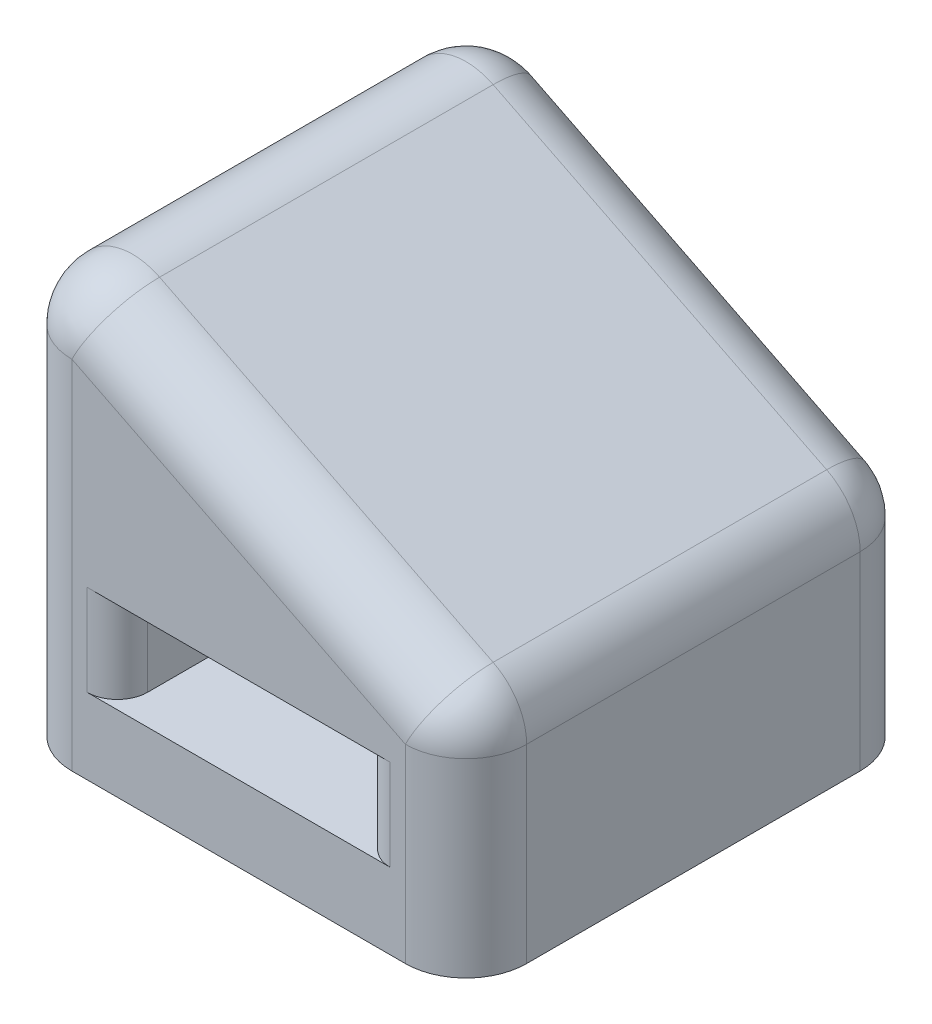
ISO-10303-21;
HEADER;
FILE_DESCRIPTION(('STEP AP214'),'2;1');
FILE_NAME('part.step','',(''),(''),'','','');
FILE_SCHEMA(('AUTOMOTIVE_DESIGN { 1 0 10303 214 1 1 1 1 }'));
ENDSEC;
DATA;
#1=APPLICATION_CONTEXT('core data for automotive mechanical design processes');
#2=APPLICATION_PROTOCOL_DEFINITION('international standard','automotive_design',2000,#1);
#3=PRODUCT_CONTEXT('',#1,'mechanical');
#4=PRODUCT('Part','Part','',(#3));
#5=PRODUCT_RELATED_PRODUCT_CATEGORY('part','',(#4));
#6=PRODUCT_DEFINITION_FORMATION('','',#4);
#7=PRODUCT_DEFINITION_CONTEXT('part definition',#1,'design');
#8=PRODUCT_DEFINITION('design','',#6,#7);
#9=PRODUCT_DEFINITION_SHAPE('','',#8);
#10=(LENGTH_UNIT() NAMED_UNIT(*) SI_UNIT(.MILLI.,.METRE.));
#11=(NAMED_UNIT(*) PLANE_ANGLE_UNIT() SI_UNIT($,.RADIAN.));
#12=(NAMED_UNIT(*) SI_UNIT($,.STERADIAN.) SOLID_ANGLE_UNIT());
#13=UNCERTAINTY_MEASURE_WITH_UNIT(LENGTH_MEASURE(1.E-05),#10,'distance_accuracy_value','');
#14=(GEOMETRIC_REPRESENTATION_CONTEXT(3) GLOBAL_UNCERTAINTY_ASSIGNED_CONTEXT((#13)) GLOBAL_UNIT_ASSIGNED_CONTEXT((#10,
#11,#12)) REPRESENTATION_CONTEXT('',''));
#15=CARTESIAN_POINT('',(0.,0.,0.));
#16=DIRECTION('',(0.,0.,1.));
#17=DIRECTION('',(1.,0.,0.));
#18=AXIS2_PLACEMENT_3D('',#15,#16,#17);
#19=CARTESIAN_POINT('',(5.,2.5,-6.5));
#20=DIRECTION('',(0.,-1.,0.));
#21=DIRECTION('',(1.,0.,0.));
#22=AXIS2_PLACEMENT_3D('',#19,#20,#21);
#23=CYLINDRICAL_SURFACE('',#22,1.);
#24=DIRECTION('',(0.,-1.,0.));
#25=VECTOR('',#24,1.);
#26=CARTESIAN_POINT('',(4.,2.5,-6.5));
#27=LINE('',#26,#25);
#28=CARTESIAN_POINT('',(4.,5.5,-6.5));
#29=VERTEX_POINT('',#28);
#30=CARTESIAN_POINT('',(4.,2.5,-6.5));
#31=VERTEX_POINT('',#30);
#32=EDGE_CURVE('E303',#29,#31,#27,.T.);
#33=ORIENTED_EDGE('',*,*,#32,.F.);
#34=CARTESIAN_POINT('',(5.,5.5,-6.5));
#35=DIRECTION('',(0.,1.,0.));
#36=DIRECTION('',(0.,0.,1.));
#37=AXIS2_PLACEMENT_3D('',#34,#35,#36);
#38=CIRCLE('',#37,1.);
#39=CARTESIAN_POINT('',(5.,5.5,-7.5));
#40=VERTEX_POINT('',#39);
#41=EDGE_CURVE('E40',#29,#40,#38,.F.);
#42=ORIENTED_EDGE('',*,*,#41,.T.);
#43=DIRECTION('',(0.,-1.,0.));
#44=VECTOR('',#43,1.);
#45=CARTESIAN_POINT('',(5.,15.,-7.5));
#46=LINE('',#45,#44);
#47=CARTESIAN_POINT('',(5.,2.5,-7.5));
#48=VERTEX_POINT('',#47);
#49=EDGE_CURVE('E306',#48,#40,#46,.F.);
#50=ORIENTED_EDGE('',*,*,#49,.F.);
#51=CARTESIAN_POINT('',(5.,2.5,-6.5));
#52=DIRECTION('',(0.,-1.,0.));
#53=DIRECTION('',(1.,0.,0.));
#54=AXIS2_PLACEMENT_3D('',#51,#52,#53);
#55=CIRCLE('',#54,1.);
#56=EDGE_CURVE('E11',#48,#31,#55,.F.);
#57=ORIENTED_EDGE('',*,*,#56,.T.);
#58=EDGE_LOOP('',(#33,#42,#50,#57));
#59=FACE_BOUND('',#58,.T.);
#60=ADVANCED_FACE('F33',(#59),#23,.T.);
#61=CARTESIAN_POINT('',(-5.,2.5,-6.5));
#62=DIRECTION('',(0.,1.,0.));
#63=DIRECTION('',(0.,0.,1.));
#64=AXIS2_PLACEMENT_3D('',#61,#62,#63);
#65=CYLINDRICAL_SURFACE('',#64,1.);
#66=DIRECTION('',(0.,1.,0.));
#67=VECTOR('',#66,1.);
#68=CARTESIAN_POINT('',(-4.,2.5,-6.5));
#69=LINE('',#68,#67);
#70=CARTESIAN_POINT('',(-4.,2.5,-6.5));
#71=VERTEX_POINT('',#70);
#72=CARTESIAN_POINT('',(-4.,5.5,-6.5));
#73=VERTEX_POINT('',#72);
#74=EDGE_CURVE('E293',#71,#73,#69,.T.);
#75=ORIENTED_EDGE('',*,*,#74,.F.);
#76=CARTESIAN_POINT('',(-5.,2.5,-6.5));
#77=DIRECTION('',(0.,-1.,0.));
#78=DIRECTION('',(1.,0.,0.));
#79=AXIS2_PLACEMENT_3D('',#76,#77,#78);
#80=CIRCLE('',#79,1.);
#81=CARTESIAN_POINT('',(-5.,2.5,-7.5));
#82=VERTEX_POINT('',#81);
#83=EDGE_CURVE('E298',#71,#82,#80,.F.);
#84=ORIENTED_EDGE('',*,*,#83,.T.);
#85=DIRECTION('',(0.,1.,0.));
#86=VECTOR('',#85,1.);
#87=CARTESIAN_POINT('',(-5.,15.,-7.5));
#88=LINE('',#87,#86);
#89=CARTESIAN_POINT('',(-5.,5.5,-7.5));
#90=VERTEX_POINT('',#89);
#91=EDGE_CURVE('E296',#90,#82,#88,.F.);
#92=ORIENTED_EDGE('',*,*,#91,.F.);
#93=CARTESIAN_POINT('',(-5.,5.5,-6.5));
#94=DIRECTION('',(0.,1.,0.));
#95=DIRECTION('',(0.,0.,1.));
#96=AXIS2_PLACEMENT_3D('',#93,#94,#95);
#97=CIRCLE('',#96,1.);
#98=EDGE_CURVE('E301',#90,#73,#97,.F.);
#99=ORIENTED_EDGE('',*,*,#98,.T.);
#100=EDGE_LOOP('',(#75,#84,#92,#99));
#101=FACE_BOUND('',#100,.T.);
#102=ADVANCED_FACE('F320',(#101),#65,.T.);
#103=CARTESIAN_POINT('',(5.,2.5,6.5));
#104=DIRECTION('',(0.,1.,0.));
#105=DIRECTION('',(-1.,0.,0.));
#106=AXIS2_PLACEMENT_3D('',#103,#104,#105);
#107=CYLINDRICAL_SURFACE('',#106,1.);
#108=DIRECTION('',(0.,1.,0.));
#109=VECTOR('',#108,1.);
#110=CARTESIAN_POINT('',(4.,2.5,6.5));
#111=LINE('',#110,#109);
#112=CARTESIAN_POINT('',(4.,2.5,6.5));
#113=VERTEX_POINT('',#112);
#114=CARTESIAN_POINT('',(4.,5.5,6.5));
#115=VERTEX_POINT('',#114);
#116=EDGE_CURVE('E281',#113,#115,#111,.T.);
#117=ORIENTED_EDGE('',*,*,#116,.F.);
#118=CARTESIAN_POINT('',(5.,2.5,6.5));
#119=DIRECTION('',(0.,-1.,0.));
#120=DIRECTION('',(1.,0.,0.));
#121=AXIS2_PLACEMENT_3D('',#118,#119,#120);
#122=CIRCLE('',#121,1.);
#123=CARTESIAN_POINT('',(5.,2.5,7.5));
#124=VERTEX_POINT('',#123);
#125=EDGE_CURVE('E287',#113,#124,#122,.F.);
#126=ORIENTED_EDGE('',*,*,#125,.T.);
#127=DIRECTION('',(0.,1.,0.));
#128=VECTOR('',#127,1.);
#129=CARTESIAN_POINT('',(5.,15.,7.5));
#130=LINE('',#129,#128);
#131=CARTESIAN_POINT('',(5.,5.5,7.5));
#132=VERTEX_POINT('',#131);
#133=EDGE_CURVE('E284',#132,#124,#130,.F.);
#134=ORIENTED_EDGE('',*,*,#133,.F.);
#135=CARTESIAN_POINT('',(5.,5.5,6.5));
#136=DIRECTION('',(0.,1.,0.));
#137=DIRECTION('',(0.,0.,1.));
#138=AXIS2_PLACEMENT_3D('',#135,#136,#137);
#139=CIRCLE('',#138,1.);
#140=EDGE_CURVE('E290',#132,#115,#139,.F.);
#141=ORIENTED_EDGE('',*,*,#140,.T.);
#142=EDGE_LOOP('',(#117,#126,#134,#141));
#143=FACE_BOUND('',#142,.T.);
#144=ADVANCED_FACE('F343',(#143),#107,.T.);
#145=CARTESIAN_POINT('',(-5.,15.,6.5));
#146=DIRECTION('',(0.,1.,0.));
#147=DIRECTION('',(0.,0.,1.));
#148=AXIS2_PLACEMENT_3D('',#145,#146,#147);
#149=CYLINDRICAL_SURFACE('',#148,1.);
#150=DIRECTION('',(0.,1.,0.));
#151=VECTOR('',#150,1.);
#152=CARTESIAN_POINT('',(-5.,15.,7.5));
#153=LINE('',#152,#151);
#154=CARTESIAN_POINT('',(-5.,2.5,7.5));
#155=VERTEX_POINT('',#154);
#156=CARTESIAN_POINT('',(-5.,5.5,7.5));
#157=VERTEX_POINT('',#156);
#158=EDGE_CURVE('E269',#155,#157,#153,.T.);
#159=ORIENTED_EDGE('',*,*,#158,.F.);
#160=CARTESIAN_POINT('',(-5.,2.5,6.5));
#161=DIRECTION('',(0.,-1.,0.));
#162=DIRECTION('',(1.,0.,0.));
#163=AXIS2_PLACEMENT_3D('',#160,#161,#162);
#164=CIRCLE('',#163,1.);
#165=CARTESIAN_POINT('',(-4.,2.5,6.5));
#166=VERTEX_POINT('',#165);
#167=EDGE_CURVE('E275',#155,#166,#164,.F.);
#168=ORIENTED_EDGE('',*,*,#167,.T.);
#169=DIRECTION('',(0.,1.,0.));
#170=VECTOR('',#169,1.);
#171=CARTESIAN_POINT('',(-4.,2.5,6.5));
#172=LINE('',#171,#170);
#173=CARTESIAN_POINT('',(-4.,5.5,6.5));
#174=VERTEX_POINT('',#173);
#175=EDGE_CURVE('E272',#174,#166,#172,.F.);
#176=ORIENTED_EDGE('',*,*,#175,.F.);
#177=CARTESIAN_POINT('',(-5.,5.5,6.5));
#178=DIRECTION('',(0.,1.,0.));
#179=DIRECTION('',(0.,0.,1.));
#180=AXIS2_PLACEMENT_3D('',#177,#178,#179);
#181=CIRCLE('',#180,1.);
#182=EDGE_CURVE('E278',#174,#157,#181,.F.);
#183=ORIENTED_EDGE('',*,*,#182,.T.);
#184=EDGE_LOOP('',(#159,#168,#176,#183));
#185=FACE_BOUND('',#184,.T.);
#186=ADVANCED_FACE('F337',(#185),#149,.T.);
#187=CARTESIAN_POINT('',(-5.5,11.7639320225002,-7.5));
#188=DIRECTION('',(0.,0.,1.));
#189=DIRECTION('',(1.,0.,0.));
#190=AXIS2_PLACEMENT_3D('',#187,#188,#189);
#191=CYLINDRICAL_SURFACE('',#190,2.);
#192=CARTESIAN_POINT('',(-5.5,11.7639320225002,5.49999999999999));
#193=DIRECTION('',(0.,0.,1.));
#194=DIRECTION('',(1.,0.,0.));
#195=AXIS2_PLACEMENT_3D('',#192,#193,#194);
#196=CIRCLE('',#195,2.);
#197=CARTESIAN_POINT('',(-4.60557280900008,13.5527864045,5.49999999999999));
#198=VERTEX_POINT('',#197);
#199=CARTESIAN_POINT('',(-7.5,11.7639320225002,5.49999999999999));
#200=VERTEX_POINT('',#199);
#201=EDGE_CURVE('E267',#198,#200,#196,.T.);
#202=ORIENTED_EDGE('',*,*,#201,.F.);
#203=DIRECTION('',(0.,0.,1.));
#204=VECTOR('',#203,1.);
#205=CARTESIAN_POINT('',(-4.60557280900008,13.5527864045,-7.5));
#206=LINE('',#205,#204);
#207=CARTESIAN_POINT('',(-4.60557280900008,13.5527864045,-5.49999999999999));
#208=VERTEX_POINT('',#207);
#209=EDGE_CURVE('E223',#208,#198,#206,.T.);
#210=ORIENTED_EDGE('',*,*,#209,.F.);
#211=CARTESIAN_POINT('',(-5.5,11.7639320225002,-5.5));
#212=DIRECTION('',(0.,0.,1.));
#213=DIRECTION('',(1.,0.,0.));
#214=AXIS2_PLACEMENT_3D('',#211,#212,#213);
#215=CIRCLE('',#214,2.);
#216=CARTESIAN_POINT('',(-7.5,11.7639320225002,-5.49999999999999));
#217=VERTEX_POINT('',#216);
#218=EDGE_CURVE('E265',#208,#217,#215,.T.);
#219=ORIENTED_EDGE('',*,*,#218,.T.);
#220=DIRECTION('',(0.,0.,1.));
#221=VECTOR('',#220,1.);
#222=CARTESIAN_POINT('',(-7.5,11.7639320225002,5.49999999999999));
#223=LINE('',#222,#221);
#224=EDGE_CURVE('E250',#200,#217,#223,.F.);
#225=ORIENTED_EDGE('',*,*,#224,.F.);
#226=EDGE_LOOP('',(#202,#210,#219,#225));
#227=FACE_BOUND('',#226,.T.);
#228=ADVANCED_FACE('F370',(#227),#191,.T.);
#229=CARTESIAN_POINT('',(-5.5,11.7639320225002,-5.5));
#230=DIRECTION('',(-0.447213595499958,-0.894427190999916,0.));
#231=DIRECTION('',(0.894427190999916,-0.447213595499958,0.));
#232=AXIS2_PLACEMENT_3D('',#229,#230,#231);
#233=SPHERICAL_SURFACE('',#232,2.);
#234=ORIENTED_EDGE('',*,*,#218,.F.);
#235=CARTESIAN_POINT('',(-5.5,11.7639320225002,-5.5));
#236=DIRECTION('',(-0.894427190999916,0.447213595499958,0.));
#237=DIRECTION('',(-0.447213595499958,-0.894427190999916,0.));
#238=AXIS2_PLACEMENT_3D('',#235,#236,#237);
#239=CIRCLE('',#238,2.);
#240=CARTESIAN_POINT('',(-5.5,11.7639320225002,-7.5));
#241=VERTEX_POINT('',#240);
#242=EDGE_CURVE('E263',#208,#241,#239,.T.);
#243=ORIENTED_EDGE('',*,*,#242,.T.);
#244=CARTESIAN_POINT('',(-5.5,11.7639320225002,-5.5));
#245=DIRECTION('',(0.,-1.,0.));
#246=DIRECTION('',(0.,0.,-1.));
#247=AXIS2_PLACEMENT_3D('',#244,#245,#246);
#248=CIRCLE('',#247,2.);
#249=EDGE_CURVE('E247',#217,#241,#248,.T.);
#250=ORIENTED_EDGE('',*,*,#249,.F.);
#251=EDGE_LOOP('',(#234,#243,#250));
#252=FACE_BOUND('',#251,.T.);
#253=ADVANCED_FACE('F373',(#252),#233,.T.);
#254=CARTESIAN_POINT('',(-8.39442719099991,13.2111456180002,-5.5));
#255=DIRECTION('',(-0.894427190999916,0.447213595499958,0.));
#256=DIRECTION('',(-0.447213595499958,-0.894427190999916,0.));
#257=AXIS2_PLACEMENT_3D('',#254,#255,#256);
#258=CYLINDRICAL_SURFACE('',#257,2.);
#259=ORIENTED_EDGE('',*,*,#242,.F.);
#260=DIRECTION('',(-0.894427190999916,0.447213595499958,0.));
#261=VECTOR('',#260,1.);
#262=CARTESIAN_POINT('',(-7.5,15.,-5.5));
#263=LINE('',#262,#261);
#264=CARTESIAN_POINT('',(6.3944271909999,8.05278640450005,-5.5));
#265=VERTEX_POINT('',#264);
#266=EDGE_CURVE('E226',#265,#208,#263,.T.);
#267=ORIENTED_EDGE('',*,*,#266,.F.);
#268=CARTESIAN_POINT('',(5.5,6.26393202250021,-5.5));
#269=DIRECTION('',(-0.894427190999916,0.447213595499958,0.));
#270=DIRECTION('',(-0.447213595499958,-0.894427190999916,0.));
#271=AXIS2_PLACEMENT_3D('',#268,#269,#270);
#272=CIRCLE('',#271,2.);
#273=CARTESIAN_POINT('',(5.49999999999999,6.26393202250022,-7.5));
#274=VERTEX_POINT('',#273);
#275=EDGE_CURVE('E261',#265,#274,#272,.T.);
#276=ORIENTED_EDGE('',*,*,#275,.T.);
#277=DIRECTION('',(-0.894427190999916,0.447213595499958,0.));
#278=VECTOR('',#277,1.);
#279=CARTESIAN_POINT('',(-6.7944271909999,12.4111456180002,-7.5));
#280=LINE('',#279,#278);
#281=EDGE_CURVE('E165',#241,#274,#280,.F.);
#282=ORIENTED_EDGE('',*,*,#281,.F.);
#283=EDGE_LOOP('',(#259,#267,#276,#282));
#284=FACE_BOUND('',#283,.T.);
#285=ADVANCED_FACE('F377',(#284),#258,.T.);
#286=CARTESIAN_POINT('',(5.5,6.26393202250021,-5.5));
#287=DIRECTION('',(-0.447213595499958,-0.894427190999916,0.));
#288=DIRECTION('',(0.894427190999916,-0.447213595499958,0.));
#289=AXIS2_PLACEMENT_3D('',#286,#287,#288);
#290=SPHERICAL_SURFACE('',#289,2.);
#291=ORIENTED_EDGE('',*,*,#275,.F.);
#292=CARTESIAN_POINT('',(5.5,6.26393202250021,-5.49999999999999));
#293=DIRECTION('',(0.,0.,-1.));
#294=DIRECTION('',(-1.,0.,0.));
#295=AXIS2_PLACEMENT_3D('',#292,#293,#294);
#296=CIRCLE('',#295,2.);
#297=CARTESIAN_POINT('',(7.5,6.26393202250021,-5.49999999999999));
#298=VERTEX_POINT('',#297);
#299=EDGE_CURVE('E259',#265,#298,#296,.T.);
#300=ORIENTED_EDGE('',*,*,#299,.T.);
#301=CARTESIAN_POINT('',(5.5,6.26393202250021,-5.5));
#302=DIRECTION('',(0.,-1.,0.));
#303=DIRECTION('',(0.,0.,-1.));
#304=AXIS2_PLACEMENT_3D('',#301,#302,#303);
#305=CIRCLE('',#304,2.);
#306=EDGE_CURVE('E244',#274,#298,#305,.T.);
#307=ORIENTED_EDGE('',*,*,#306,.F.);
#308=EDGE_LOOP('',(#291,#300,#307));
#309=FACE_BOUND('',#308,.T.);
#310=ADVANCED_FACE('F381',(#309),#290,.T.);
#311=CARTESIAN_POINT('',(5.5,6.26393202250021,-7.5));
#312=DIRECTION('',(0.,0.,-1.));
#313=DIRECTION('',(-1.,0.,0.));
#314=AXIS2_PLACEMENT_3D('',#311,#312,#313);
#315=CYLINDRICAL_SURFACE('',#314,2.);
#316=ORIENTED_EDGE('',*,*,#299,.F.);
#317=DIRECTION('',(0.,0.,-1.));
#318=VECTOR('',#317,1.);
#319=CARTESIAN_POINT('',(6.39442719099991,8.05278640450004,-7.5));
#320=LINE('',#319,#318);
#321=CARTESIAN_POINT('',(6.39442719099992,8.05278640450004,5.49999999999999));
#322=VERTEX_POINT('',#321);
#323=EDGE_CURVE('E229',#322,#265,#320,.T.);
#324=ORIENTED_EDGE('',*,*,#323,.F.);
#325=CARTESIAN_POINT('',(5.5,6.26393202250021,5.5));
#326=DIRECTION('',(0.,0.,-1.));
#327=DIRECTION('',(-1.,0.,0.));
#328=AXIS2_PLACEMENT_3D('',#325,#326,#327);
#329=CIRCLE('',#328,2.);
#330=CARTESIAN_POINT('',(7.5,6.26393202250021,5.49999999999999));
#331=VERTEX_POINT('',#330);
#332=EDGE_CURVE('E257',#322,#331,#329,.T.);
#333=ORIENTED_EDGE('',*,*,#332,.T.);
#334=DIRECTION('',(0.,0.,-1.));
#335=VECTOR('',#334,1.);
#336=CARTESIAN_POINT('',(7.5,6.26393202250021,5.49999999999999));
#337=LINE('',#336,#335);
#338=EDGE_CURVE('E241',#298,#331,#337,.F.);
#339=ORIENTED_EDGE('',*,*,#338,.F.);
#340=EDGE_LOOP('',(#316,#324,#333,#339));
#341=FACE_BOUND('',#340,.T.);
#342=ADVANCED_FACE('F385',(#341),#315,.T.);
#343=CARTESIAN_POINT('',(5.5,6.26393202250021,5.5));
#344=DIRECTION('',(-0.447213595499958,-0.894427190999916,0.));
#345=DIRECTION('',(0.894427190999916,-0.447213595499958,0.));
#346=AXIS2_PLACEMENT_3D('',#343,#344,#345);
#347=SPHERICAL_SURFACE('',#346,2.);
#348=ORIENTED_EDGE('',*,*,#332,.F.);
#349=CARTESIAN_POINT('',(5.49999999999999,6.26393202250022,5.5));
#350=DIRECTION('',(0.894427190999916,-0.447213595499958,0.));
#351=DIRECTION('',(0.447213595499958,0.894427190999916,0.));
#352=AXIS2_PLACEMENT_3D('',#349,#350,#351);
#353=CIRCLE('',#352,2.);
#354=CARTESIAN_POINT('',(5.49999999999999,6.26393202250021,7.5));
#355=VERTEX_POINT('',#354);
#356=EDGE_CURVE('E255',#322,#355,#353,.T.);
#357=ORIENTED_EDGE('',*,*,#356,.T.);
#358=CARTESIAN_POINT('',(5.5,6.26393202250021,5.5));
#359=DIRECTION('',(0.,-1.,0.));
#360=DIRECTION('',(0.,0.,-1.));
#361=AXIS2_PLACEMENT_3D('',#358,#359,#360);
#362=CIRCLE('',#361,2.);
#363=EDGE_CURVE('E238',#331,#355,#362,.T.);
#364=ORIENTED_EDGE('',*,*,#363,.F.);
#365=EDGE_LOOP('',(#348,#357,#364));
#366=FACE_BOUND('',#365,.T.);
#367=ADVANCED_FACE('F389',(#366),#347,.T.);
#368=CARTESIAN_POINT('',(-8.39442719099991,13.2111456180002,5.5));
#369=DIRECTION('',(0.894427190999916,-0.447213595499958,0.));
#370=DIRECTION('',(0.447213595499958,0.894427190999916,0.));
#371=AXIS2_PLACEMENT_3D('',#368,#369,#370);
#372=CYLINDRICAL_SURFACE('',#371,2.);
#373=ORIENTED_EDGE('',*,*,#356,.F.);
#374=DIRECTION('',(0.894427190999916,-0.447213595499958,0.));
#375=VECTOR('',#374,1.);
#376=CARTESIAN_POINT('',(-7.5,15.,5.5));
#377=LINE('',#376,#375);
#378=EDGE_CURVE('E232',#198,#322,#377,.T.);
#379=ORIENTED_EDGE('',*,*,#378,.F.);
#380=CARTESIAN_POINT('',(-5.5,11.7639320225002,5.5));
#381=DIRECTION('',(0.894427190999916,-0.447213595499958,0.));
#382=DIRECTION('',(0.447213595499958,0.894427190999916,0.));
#383=AXIS2_PLACEMENT_3D('',#380,#381,#382);
#384=CIRCLE('',#383,2.);
#385=CARTESIAN_POINT('',(-5.49999999999999,11.7639320225002,7.5));
#386=VERTEX_POINT('',#385);
#387=EDGE_CURVE('E253',#198,#386,#384,.T.);
#388=ORIENTED_EDGE('',*,*,#387,.T.);
#389=DIRECTION('',(0.894427190999916,-0.447213595499958,0.));
#390=VECTOR('',#389,1.);
#391=CARTESIAN_POINT('',(-6.7944271909999,12.4111456180002,7.5));
#392=LINE('',#391,#390);
#393=EDGE_CURVE('E235',#355,#386,#392,.F.);
#394=ORIENTED_EDGE('',*,*,#393,.F.);
#395=EDGE_LOOP('',(#373,#379,#388,#394));
#396=FACE_BOUND('',#395,.T.);
#397=ADVANCED_FACE('F393',(#396),#372,.T.);
#398=CARTESIAN_POINT('',(-5.5,11.7639320225002,5.5));
#399=DIRECTION('',(-0.447213595499958,-0.894427190999916,0.));
#400=DIRECTION('',(0.894427190999916,-0.447213595499958,0.));
#401=AXIS2_PLACEMENT_3D('',#398,#399,#400);
#402=SPHERICAL_SURFACE('',#401,2.);
#403=ORIENTED_EDGE('',*,*,#387,.F.);
#404=ORIENTED_EDGE('',*,*,#201,.T.);
#405=CARTESIAN_POINT('',(-5.5,11.7639320225002,5.5));
#406=DIRECTION('',(0.,-1.,0.));
#407=DIRECTION('',(0.,0.,-1.));
#408=AXIS2_PLACEMENT_3D('',#405,#406,#407);
#409=CIRCLE('',#408,2.);
#410=EDGE_CURVE('E170',#386,#200,#409,.T.);
#411=ORIENTED_EDGE('',*,*,#410,.F.);
#412=EDGE_LOOP('',(#403,#404,#411));
#413=FACE_BOUND('',#412,.T.);
#414=ADVANCED_FACE('F397',(#413),#402,.T.);
#415=CARTESIAN_POINT('',(5.5,15.,-5.5));
#416=DIRECTION('',(0.,-1.,0.));
#417=DIRECTION('',(0.,0.,-1.));
#418=AXIS2_PLACEMENT_3D('',#415,#416,#417);
#419=CYLINDRICAL_SURFACE('',#418,2.);
#420=DIRECTION('',(0.,-1.,0.));
#421=VECTOR('',#420,1.);
#422=CARTESIAN_POINT('',(5.49999999999999,15.,-7.5));
#423=LINE('',#422,#421);
#424=CARTESIAN_POINT('',(5.49999999999999,0.,-7.5));
#425=VERTEX_POINT('',#424);
#426=EDGE_CURVE('E158',#274,#425,#423,.T.);
#427=ORIENTED_EDGE('',*,*,#426,.F.);
#428=ORIENTED_EDGE('',*,*,#306,.T.);
#429=DIRECTION('',(0.,-1.,0.));
#430=VECTOR('',#429,1.);
#431=CARTESIAN_POINT('',(7.5,15.,-5.49999999999999));
#432=LINE('',#431,#430);
#433=CARTESIAN_POINT('',(7.5,0.,-5.49999999999999));
#434=VERTEX_POINT('',#433);
#435=EDGE_CURVE('E184',#298,#434,#432,.T.);
#436=ORIENTED_EDGE('',*,*,#435,.T.);
#437=CARTESIAN_POINT('',(5.5,0.,-5.5));
#438=DIRECTION('',(0.,1.,0.));
#439=DIRECTION('',(0.,0.,1.));
#440=AXIS2_PLACEMENT_3D('',#437,#438,#439);
#441=CIRCLE('',#440,2.);
#442=EDGE_CURVE('E177',#434,#425,#441,.T.);
#443=ORIENTED_EDGE('',*,*,#442,.T.);
#444=EDGE_LOOP('',(#427,#428,#436,#443));
#445=FACE_BOUND('',#444,.T.);
#446=ADVANCED_FACE('F182',(#445),#419,.T.);
#447=CARTESIAN_POINT('',(-5.49999999999999,15.,-7.5));
#448=DIRECTION('',(0.,0.,1.));
#449=DIRECTION('',(1.,0.,0.));
#450=AXIS2_PLACEMENT_3D('',#447,#448,#449);
#451=PLANE('',#450);
#452=ORIENTED_EDGE('',*,*,#49,.T.);
#453=DIRECTION('',(-1.,0.,0.));
#454=VECTOR('',#453,1.);
#455=CARTESIAN_POINT('',(-4.,5.5,-7.5));
#456=LINE('',#455,#454);
#457=EDGE_CURVE('E47',#40,#90,#456,.T.);
#458=ORIENTED_EDGE('',*,*,#457,.T.);
#459=ORIENTED_EDGE('',*,*,#91,.T.);
#460=DIRECTION('',(1.,0.,0.));
#461=VECTOR('',#460,1.);
#462=CARTESIAN_POINT('',(-4.,2.5,-7.5));
#463=LINE('',#462,#461);
#464=EDGE_CURVE('E55',#82,#48,#463,.T.);
#465=ORIENTED_EDGE('',*,*,#464,.T.);
#466=EDGE_LOOP('',(#452,#458,#459,#465));
#467=FACE_BOUND('',#466,.T.);
#468=DIRECTION('',(0.,-1.,0.));
#469=VECTOR('',#468,1.);
#470=CARTESIAN_POINT('',(-5.5,15.,-7.5));
#471=LINE('',#470,#469);
#472=CARTESIAN_POINT('',(-5.5,0.,-7.5));
#473=VERTEX_POINT('',#472);
#474=EDGE_CURVE('E171',#241,#473,#471,.T.);
#475=ORIENTED_EDGE('',*,*,#474,.F.);
#476=ORIENTED_EDGE('',*,*,#281,.T.);
#477=ORIENTED_EDGE('',*,*,#426,.T.);
#478=DIRECTION('',(-1.,0.,0.));
#479=VECTOR('',#478,1.);
#480=CARTESIAN_POINT('',(-5.49999999999999,0.,-7.5));
#481=LINE('',#480,#479);
#482=EDGE_CURVE('E162',#425,#473,#481,.T.);
#483=ORIENTED_EDGE('',*,*,#482,.T.);
#484=EDGE_LOOP('',(#475,#476,#477,#483));
#485=FACE_BOUND('',#484,.T.);
#486=ADVANCED_FACE('F161',(#467,#485),#451,.F.);
#487=CARTESIAN_POINT('',(-5.5,15.,-5.5));
#488=DIRECTION('',(0.,-1.,0.));
#489=DIRECTION('',(0.,0.,-1.));
#490=AXIS2_PLACEMENT_3D('',#487,#488,#489);
#491=CYLINDRICAL_SURFACE('',#490,2.);
#492=DIRECTION('',(0.,-1.,0.));
#493=VECTOR('',#492,1.);
#494=CARTESIAN_POINT('',(-7.5,15.,-5.49999999999999));
#495=LINE('',#494,#493);
#496=CARTESIAN_POINT('',(-7.5,0.,-5.49999999999999));
#497=VERTEX_POINT('',#496);
#498=EDGE_CURVE('E218',#217,#497,#495,.T.);
#499=ORIENTED_EDGE('',*,*,#498,.F.);
#500=ORIENTED_EDGE('',*,*,#249,.T.);
#501=ORIENTED_EDGE('',*,*,#474,.T.);
#502=CARTESIAN_POINT('',(-5.5,0.,-5.5));
#503=DIRECTION('',(0.,1.,0.));
#504=DIRECTION('',(0.,0.,-1.));
#505=AXIS2_PLACEMENT_3D('',#502,#503,#504);
#506=CIRCLE('',#505,2.);
#507=EDGE_CURVE('E180',#473,#497,#506,.T.);
#508=ORIENTED_EDGE('',*,*,#507,.T.);
#509=EDGE_LOOP('',(#499,#500,#501,#508));
#510=FACE_BOUND('',#509,.T.);
#511=ADVANCED_FACE('F406',(#510),#491,.T.);
#512=CARTESIAN_POINT('',(-7.5,15.,5.49999999999999));
#513=DIRECTION('',(1.,0.,0.));
#514=DIRECTION('',(0.,0.,-1.));
#515=AXIS2_PLACEMENT_3D('',#512,#513,#514);
#516=PLANE('',#515);
#517=DIRECTION('',(0.,-1.,0.));
#518=VECTOR('',#517,1.);
#519=CARTESIAN_POINT('',(-7.5,15.,5.49999999999999));
#520=LINE('',#519,#518);
#521=CARTESIAN_POINT('',(-7.5,0.,5.49999999999999));
#522=VERTEX_POINT('',#521);
#523=EDGE_CURVE('E216',#200,#522,#520,.T.);
#524=ORIENTED_EDGE('',*,*,#523,.F.);
#525=ORIENTED_EDGE('',*,*,#224,.T.);
#526=ORIENTED_EDGE('',*,*,#498,.T.);
#527=DIRECTION('',(0.,0.,1.));
#528=VECTOR('',#527,1.);
#529=CARTESIAN_POINT('',(-7.5,0.,5.49999999999999));
#530=LINE('',#529,#528);
#531=EDGE_CURVE('E195',#497,#522,#530,.T.);
#532=ORIENTED_EDGE('',*,*,#531,.T.);
#533=EDGE_LOOP('',(#524,#525,#526,#532));
#534=FACE_BOUND('',#533,.T.);
#535=ADVANCED_FACE('F409',(#534),#516,.F.);
#536=CARTESIAN_POINT('',(-5.5,15.,5.5));
#537=DIRECTION('',(0.,-1.,0.));
#538=DIRECTION('',(0.,0.,-1.));
#539=AXIS2_PLACEMENT_3D('',#536,#537,#538);
#540=CYLINDRICAL_SURFACE('',#539,2.);
#541=DIRECTION('',(0.,-1.,0.));
#542=VECTOR('',#541,1.);
#543=CARTESIAN_POINT('',(-5.49999999999999,15.,7.5));
#544=LINE('',#543,#542);
#545=CARTESIAN_POINT('',(-5.49999999999999,0.,7.5));
#546=VERTEX_POINT('',#545);
#547=EDGE_CURVE('E214',#386,#546,#544,.T.);
#548=ORIENTED_EDGE('',*,*,#547,.F.);
#549=ORIENTED_EDGE('',*,*,#410,.T.);
#550=ORIENTED_EDGE('',*,*,#523,.T.);
#551=CARTESIAN_POINT('',(-5.5,0.,5.5));
#552=DIRECTION('',(0.,1.,0.));
#553=DIRECTION('',(0.,0.,-1.));
#554=AXIS2_PLACEMENT_3D('',#551,#552,#553);
#555=CIRCLE('',#554,2.);
#556=EDGE_CURVE('E198',#522,#546,#555,.T.);
#557=ORIENTED_EDGE('',*,*,#556,.T.);
#558=EDGE_LOOP('',(#548,#549,#550,#557));
#559=FACE_BOUND('',#558,.T.);
#560=ADVANCED_FACE('F413',(#559),#540,.T.);
#561=CARTESIAN_POINT('',(-5.49999999999999,15.,7.5));
#562=DIRECTION('',(0.,0.,-1.));
#563=DIRECTION('',(-1.,0.,0.));
#564=AXIS2_PLACEMENT_3D('',#561,#562,#563);
#565=PLANE('',#564);
#566=ORIENTED_EDGE('',*,*,#133,.T.);
#567=DIRECTION('',(1.,0.,0.));
#568=VECTOR('',#567,1.);
#569=CARTESIAN_POINT('',(-4.,2.5,7.5));
#570=LINE('',#569,#568);
#571=EDGE_CURVE('E312',#155,#124,#570,.T.);
#572=ORIENTED_EDGE('',*,*,#571,.F.);
#573=ORIENTED_EDGE('',*,*,#158,.T.);
#574=DIRECTION('',(-1.,0.,0.));
#575=VECTOR('',#574,1.);
#576=CARTESIAN_POINT('',(-4.,5.5,7.5));
#577=LINE('',#576,#575);
#578=EDGE_CURVE('E328',#132,#157,#577,.T.);
#579=ORIENTED_EDGE('',*,*,#578,.F.);
#580=EDGE_LOOP('',(#566,#572,#573,#579));
#581=FACE_BOUND('',#580,.T.);
#582=DIRECTION('',(0.,-1.,0.));
#583=VECTOR('',#582,1.);
#584=CARTESIAN_POINT('',(5.49999999999999,15.,7.5));
#585=LINE('',#584,#583);
#586=CARTESIAN_POINT('',(5.49999999999999,0.,7.5));
#587=VERTEX_POINT('',#586);
#588=EDGE_CURVE('E212',#355,#587,#585,.T.);
#589=ORIENTED_EDGE('',*,*,#588,.F.);
#590=ORIENTED_EDGE('',*,*,#393,.T.);
#591=ORIENTED_EDGE('',*,*,#547,.T.);
#592=DIRECTION('',(1.,0.,0.));
#593=VECTOR('',#592,1.);
#594=CARTESIAN_POINT('',(-5.49999999999999,0.,7.5));
#595=LINE('',#594,#593);
#596=EDGE_CURVE('E201',#546,#587,#595,.T.);
#597=ORIENTED_EDGE('',*,*,#596,.T.);
#598=EDGE_LOOP('',(#589,#590,#591,#597));
#599=FACE_BOUND('',#598,.T.);
#600=ADVANCED_FACE('F344',(#581,#599),#565,.F.);
#601=CARTESIAN_POINT('',(5.5,15.,5.5));
#602=DIRECTION('',(0.,-1.,0.));
#603=DIRECTION('',(0.,0.,-1.));
#604=AXIS2_PLACEMENT_3D('',#601,#602,#603);
#605=CYLINDRICAL_SURFACE('',#604,2.);
#606=DIRECTION('',(0.,-1.,0.));
#607=VECTOR('',#606,1.);
#608=CARTESIAN_POINT('',(7.5,15.,5.49999999999999));
#609=LINE('',#608,#607);
#610=CARTESIAN_POINT('',(7.5,0.,5.49999999999999));
#611=VERTEX_POINT('',#610);
#612=EDGE_CURVE('E210',#331,#611,#609,.T.);
#613=ORIENTED_EDGE('',*,*,#612,.F.);
#614=ORIENTED_EDGE('',*,*,#363,.T.);
#615=ORIENTED_EDGE('',*,*,#588,.T.);
#616=CARTESIAN_POINT('',(5.5,0.,5.5));
#617=DIRECTION('',(0.,1.,0.));
#618=DIRECTION('',(0.,0.,-1.));
#619=AXIS2_PLACEMENT_3D('',#616,#617,#618);
#620=CIRCLE('',#619,2.);
#621=EDGE_CURVE('E204',#587,#611,#620,.T.);
#622=ORIENTED_EDGE('',*,*,#621,.T.);
#623=EDGE_LOOP('',(#613,#614,#615,#622));
#624=FACE_BOUND('',#623,.T.);
#625=ADVANCED_FACE('F420',(#624),#605,.T.);
#626=CARTESIAN_POINT('',(7.5,15.,5.49999999999999));
#627=DIRECTION('',(-1.,0.,0.));
#628=DIRECTION('',(0.,0.,1.));
#629=AXIS2_PLACEMENT_3D('',#626,#627,#628);
#630=PLANE('',#629);
#631=ORIENTED_EDGE('',*,*,#435,.F.);
#632=ORIENTED_EDGE('',*,*,#338,.T.);
#633=ORIENTED_EDGE('',*,*,#612,.T.);
#634=DIRECTION('',(0.,0.,-1.));
#635=VECTOR('',#634,1.);
#636=CARTESIAN_POINT('',(7.5,0.,5.49999999999999));
#637=LINE('',#636,#635);
#638=EDGE_CURVE('E207',#611,#434,#637,.T.);
#639=ORIENTED_EDGE('',*,*,#638,.T.);
#640=EDGE_LOOP('',(#631,#632,#633,#639));
#641=FACE_BOUND('',#640,.T.);
#642=ADVANCED_FACE('F423',(#641),#630,.F.);
#643=CARTESIAN_POINT('',(5.5,0.,-5.5));
#644=DIRECTION('',(0.,1.,0.));
#645=DIRECTION('',(0.,0.,1.));
#646=AXIS2_PLACEMENT_3D('',#643,#644,#645);
#647=PLANE('',#646);
#648=ORIENTED_EDGE('',*,*,#442,.F.);
#649=ORIENTED_EDGE('',*,*,#638,.F.);
#650=ORIENTED_EDGE('',*,*,#621,.F.);
#651=ORIENTED_EDGE('',*,*,#596,.F.);
#652=ORIENTED_EDGE('',*,*,#556,.F.);
#653=ORIENTED_EDGE('',*,*,#531,.F.);
#654=ORIENTED_EDGE('',*,*,#507,.F.);
#655=ORIENTED_EDGE('',*,*,#482,.F.);
#656=EDGE_LOOP('',(#648,#649,#650,#651,#652,#653,#654,#655));
#657=FACE_BOUND('',#656,.T.);
#658=ADVANCED_FACE('F175',(#657),#647,.F.);
#659=CARTESIAN_POINT('',(-7.5,15.,-7.5));
#660=DIRECTION('',(-0.447213595499958,-0.894427190999916,0.));
#661=DIRECTION('',(0.894427190999916,-0.447213595499958,0.));
#662=AXIS2_PLACEMENT_3D('',#659,#660,#661);
#663=PLANE('',#662);
#664=ORIENTED_EDGE('',*,*,#209,.T.);
#665=ORIENTED_EDGE('',*,*,#378,.T.);
#666=ORIENTED_EDGE('',*,*,#323,.T.);
#667=ORIENTED_EDGE('',*,*,#266,.T.);
#668=EDGE_LOOP('',(#664,#665,#666,#667));
#669=FACE_BOUND('',#668,.T.);
#670=ADVANCED_FACE('F349',(#669),#663,.F.);
#671=CARTESIAN_POINT('',(4.,2.5,-7.5));
#672=DIRECTION('',(1.,0.,0.));
#673=DIRECTION('',(0.,1.,0.));
#674=AXIS2_PLACEMENT_3D('',#671,#672,#673);
#675=PLANE('',#674);
#676=DIRECTION('',(0.,0.,1.));
#677=VECTOR('',#676,1.);
#678=CARTESIAN_POINT('',(4.,5.5,-7.5));
#679=LINE('',#678,#677);
#680=EDGE_CURVE('E191',#29,#115,#679,.T.);
#681=ORIENTED_EDGE('',*,*,#680,.F.);
#682=ORIENTED_EDGE('',*,*,#32,.T.);
#683=DIRECTION('',(0.,0.,1.));
#684=VECTOR('',#683,1.);
#685=CARTESIAN_POINT('',(4.,2.5,-7.5));
#686=LINE('',#685,#684);
#687=EDGE_CURVE('E186',#31,#113,#686,.T.);
#688=ORIENTED_EDGE('',*,*,#687,.T.);
#689=ORIENTED_EDGE('',*,*,#116,.T.);
#690=EDGE_LOOP('',(#681,#682,#688,#689));
#691=FACE_BOUND('',#690,.T.);
#692=ADVANCED_FACE('F347',(#691),#675,.F.);
#693=CARTESIAN_POINT('',(-4.,2.5,-7.5));
#694=DIRECTION('',(0.,-1.,0.));
#695=DIRECTION('',(1.,0.,0.));
#696=AXIS2_PLACEMENT_3D('',#693,#694,#695);
#697=PLANE('',#696);
#698=ORIENTED_EDGE('',*,*,#571,.T.);
#699=ORIENTED_EDGE('',*,*,#125,.F.);
#700=ORIENTED_EDGE('',*,*,#687,.F.);
#701=ORIENTED_EDGE('',*,*,#56,.F.);
#702=ORIENTED_EDGE('',*,*,#464,.F.);
#703=ORIENTED_EDGE('',*,*,#83,.F.);
#704=DIRECTION('',(0.,0.,1.));
#705=VECTOR('',#704,1.);
#706=CARTESIAN_POINT('',(-4.,2.5,-7.5));
#707=LINE('',#706,#705);
#708=EDGE_CURVE('E188',#71,#166,#707,.T.);
#709=ORIENTED_EDGE('',*,*,#708,.T.);
#710=ORIENTED_EDGE('',*,*,#167,.F.);
#711=EDGE_LOOP('',(#698,#699,#700,#701,#702,#703,#709,#710));
#712=FACE_BOUND('',#711,.T.);
#713=ADVANCED_FACE('F323',(#712),#697,.F.);
#714=CARTESIAN_POINT('',(-4.,2.5,-7.5));
#715=DIRECTION('',(-1.,0.,0.));
#716=DIRECTION('',(0.,0.,1.));
#717=AXIS2_PLACEMENT_3D('',#714,#715,#716);
#718=PLANE('',#717);
#719=ORIENTED_EDGE('',*,*,#708,.F.);
#720=ORIENTED_EDGE('',*,*,#74,.T.);
#721=DIRECTION('',(0.,0.,1.));
#722=VECTOR('',#721,1.);
#723=CARTESIAN_POINT('',(-4.,5.5,-7.5));
#724=LINE('',#723,#722);
#725=EDGE_CURVE('E317',#73,#174,#724,.T.);
#726=ORIENTED_EDGE('',*,*,#725,.T.);
#727=ORIENTED_EDGE('',*,*,#175,.T.);
#728=EDGE_LOOP('',(#719,#720,#726,#727));
#729=FACE_BOUND('',#728,.T.);
#730=ADVANCED_FACE('F332',(#729),#718,.F.);
#731=CARTESIAN_POINT('',(-4.,5.5,-7.5));
#732=DIRECTION('',(0.,1.,0.));
#733=DIRECTION('',(0.,0.,1.));
#734=AXIS2_PLACEMENT_3D('',#731,#732,#733);
#735=PLANE('',#734);
#736=ORIENTED_EDGE('',*,*,#578,.T.);
#737=ORIENTED_EDGE('',*,*,#182,.F.);
#738=ORIENTED_EDGE('',*,*,#725,.F.);
#739=ORIENTED_EDGE('',*,*,#98,.F.);
#740=ORIENTED_EDGE('',*,*,#457,.F.);
#741=ORIENTED_EDGE('',*,*,#41,.F.);
#742=ORIENTED_EDGE('',*,*,#680,.T.);
#743=ORIENTED_EDGE('',*,*,#140,.F.);
#744=EDGE_LOOP('',(#736,#737,#738,#739,#740,#741,#742,#743));
#745=FACE_BOUND('',#744,.T.);
#746=ADVANCED_FACE('F315',(#745),#735,.F.);
#747=CLOSED_SHELL('',(#60,#102,#144,#186,#228,#253,#285,#310,#342,#367,#397,#414,#446,#486,#511,
#535,#560,#600,#625,#642,#658,#670,#692,#713,#730,#746));
#748=MANIFOLD_SOLID_BREP('B2',#747);
#749=ADVANCED_BREP_SHAPE_REPRESENTATION('',(#18,#748),#14);
#750=SHAPE_DEFINITION_REPRESENTATION(#9,#749);
ENDSEC;
END-ISO-10303-21;
